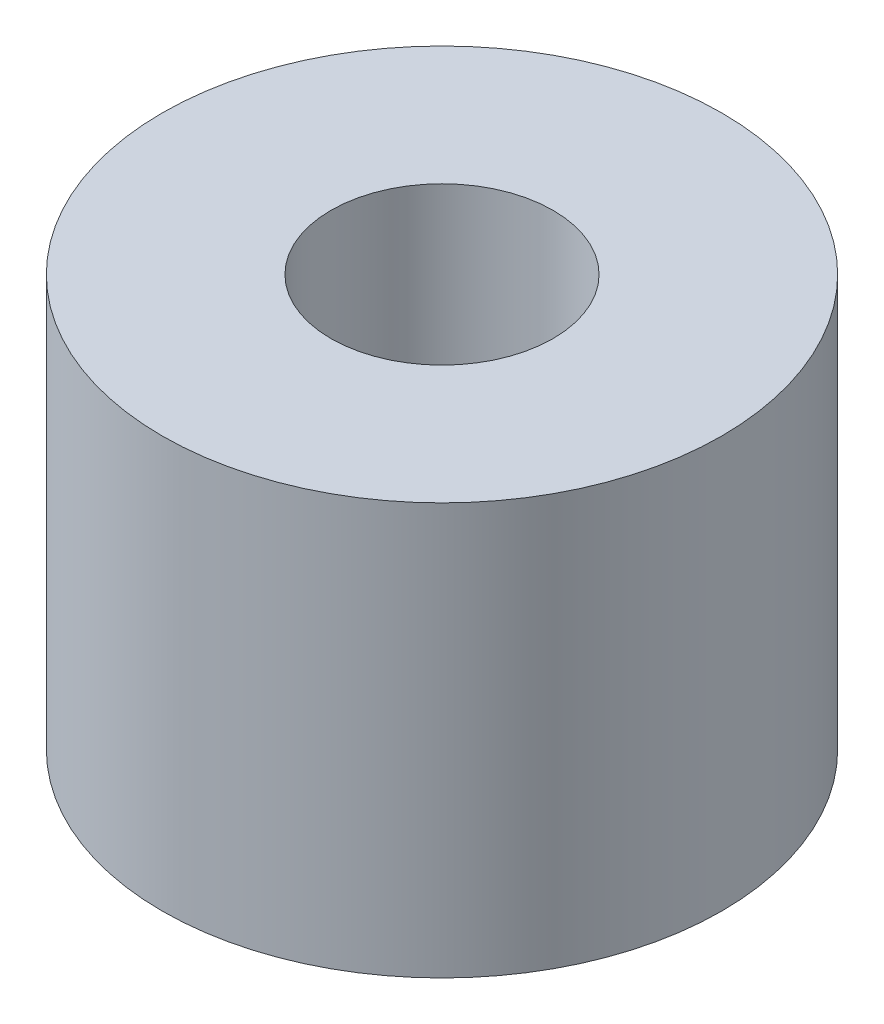
ISO-10303-21;
HEADER;
FILE_DESCRIPTION(('STEP AP214'),'2;1');
FILE_NAME('part.step','',(''),(''),'','','');
FILE_SCHEMA(('AUTOMOTIVE_DESIGN { 1 0 10303 214 1 1 1 1 }'));
ENDSEC;
DATA;
#1=APPLICATION_CONTEXT('core data for automotive mechanical design processes');
#2=APPLICATION_PROTOCOL_DEFINITION('international standard','automotive_design',2000,#1);
#3=PRODUCT_CONTEXT('',#1,'mechanical');
#4=PRODUCT('Part','Part','',(#3));
#5=PRODUCT_RELATED_PRODUCT_CATEGORY('part','',(#4));
#6=PRODUCT_DEFINITION_FORMATION('','',#4);
#7=PRODUCT_DEFINITION_CONTEXT('part definition',#1,'design');
#8=PRODUCT_DEFINITION('design','',#6,#7);
#9=PRODUCT_DEFINITION_SHAPE('','',#8);
#10=(LENGTH_UNIT() NAMED_UNIT(*) SI_UNIT(.MILLI.,.METRE.));
#11=(NAMED_UNIT(*) PLANE_ANGLE_UNIT() SI_UNIT($,.RADIAN.));
#12=(NAMED_UNIT(*) SI_UNIT($,.STERADIAN.) SOLID_ANGLE_UNIT());
#13=UNCERTAINTY_MEASURE_WITH_UNIT(LENGTH_MEASURE(1.E-05),#10,'distance_accuracy_value','');
#14=(GEOMETRIC_REPRESENTATION_CONTEXT(3) GLOBAL_UNCERTAINTY_ASSIGNED_CONTEXT((#13)) GLOBAL_UNIT_ASSIGNED_CONTEXT((#10,
#11,#12)) REPRESENTATION_CONTEXT('',''));
#15=CARTESIAN_POINT('',(0.,0.,0.));
#16=DIRECTION('',(0.,0.,1.));
#17=DIRECTION('',(1.,0.,0.));
#18=AXIS2_PLACEMENT_3D('',#15,#16,#17);
#19=CARTESIAN_POINT('',(0.,6.35,0.));
#20=DIRECTION('',(0.,1.,0.));
#21=DIRECTION('',(0.,0.,1.));
#22=AXIS2_PLACEMENT_3D('',#19,#20,#21);
#23=PLANE('',#22);
#24=CARTESIAN_POINT('',(0.,6.35,0.));
#25=DIRECTION('',(0.,1.,0.));
#26=DIRECTION('',(0.,0.,1.));
#27=AXIS2_PLACEMENT_3D('',#24,#25,#26);
#28=CIRCLE('',#27,4.318);
#29=CARTESIAN_POINT('',(0.,6.35,4.318));
#30=VERTEX_POINT('',#29);
#31=EDGE_CURVE('E10',#30,#30,#28,.T.);
#32=ORIENTED_EDGE('',*,*,#31,.T.);
#33=EDGE_LOOP('',(#32));
#34=FACE_BOUND('',#33,.T.);
#35=CARTESIAN_POINT('',(0.,6.35,0.));
#36=DIRECTION('',(0.,1.,0.));
#37=DIRECTION('',(0.,0.,1.));
#38=AXIS2_PLACEMENT_3D('',#35,#36,#37);
#39=CIRCLE('',#38,1.7145);
#40=CARTESIAN_POINT('',(0.,6.35,1.7145));
#41=VERTEX_POINT('',#40);
#42=EDGE_CURVE('E43',#41,#41,#39,.T.);
#43=ORIENTED_EDGE('',*,*,#42,.F.);
#44=EDGE_LOOP('',(#43));
#45=FACE_BOUND('',#44,.T.);
#46=ADVANCED_FACE('F32',(#34,#45),#23,.T.);
#47=CARTESIAN_POINT('',(0.,0.,0.));
#48=DIRECTION('',(0.,1.,0.));
#49=DIRECTION('',(0.,0.,1.));
#50=AXIS2_PLACEMENT_3D('',#47,#48,#49);
#51=PLANE('',#50);
#52=CARTESIAN_POINT('',(0.,0.,0.));
#53=DIRECTION('',(0.,1.,0.));
#54=DIRECTION('',(0.,0.,1.));
#55=AXIS2_PLACEMENT_3D('',#52,#53,#54);
#56=CIRCLE('',#55,4.318);
#57=CARTESIAN_POINT('',(0.,0.,4.318));
#58=VERTEX_POINT('',#57);
#59=EDGE_CURVE('E36',#58,#58,#56,.T.);
#60=ORIENTED_EDGE('',*,*,#59,.F.);
#61=EDGE_LOOP('',(#60));
#62=FACE_BOUND('',#61,.T.);
#63=CARTESIAN_POINT('',(0.,0.,0.));
#64=DIRECTION('',(0.,1.,0.));
#65=DIRECTION('',(0.,0.,1.));
#66=AXIS2_PLACEMENT_3D('',#63,#64,#65);
#67=CIRCLE('',#66,1.7145);
#68=CARTESIAN_POINT('',(0.,0.,1.7145));
#69=VERTEX_POINT('',#68);
#70=EDGE_CURVE('E45',#69,#69,#67,.T.);
#71=ORIENTED_EDGE('',*,*,#70,.T.);
#72=EDGE_LOOP('',(#71));
#73=FACE_BOUND('',#72,.T.);
#74=ADVANCED_FACE('F55',(#62,#73),#51,.F.);
#75=CARTESIAN_POINT('',(0.,6.35,0.));
#76=DIRECTION('',(0.,-1.,0.));
#77=DIRECTION('',(0.,0.,-1.));
#78=AXIS2_PLACEMENT_3D('',#75,#76,#77);
#79=CYLINDRICAL_SURFACE('',#78,4.318);
#80=ORIENTED_EDGE('',*,*,#31,.F.);
#81=EDGE_LOOP('',(#80));
#82=FACE_BOUND('',#81,.T.);
#83=ORIENTED_EDGE('',*,*,#59,.T.);
#84=EDGE_LOOP('',(#83));
#85=FACE_BOUND('',#84,.T.);
#86=ADVANCED_FACE('F34',(#82,#85),#79,.T.);
#87=CARTESIAN_POINT('',(0.,6.35,0.));
#88=DIRECTION('',(0.,-1.,0.));
#89=DIRECTION('',(0.,0.,-1.));
#90=AXIS2_PLACEMENT_3D('',#87,#88,#89);
#91=CYLINDRICAL_SURFACE('',#90,1.7145);
#92=ORIENTED_EDGE('',*,*,#42,.T.);
#93=EDGE_LOOP('',(#92));
#94=FACE_BOUND('',#93,.T.);
#95=ORIENTED_EDGE('',*,*,#70,.F.);
#96=EDGE_LOOP('',(#95));
#97=FACE_BOUND('',#96,.T.);
#98=ADVANCED_FACE('F51',(#94,#97),#91,.F.);
#99=CLOSED_SHELL('',(#46,#74,#86,#98));
#100=MANIFOLD_SOLID_BREP('B2',#99);
#101=ADVANCED_BREP_SHAPE_REPRESENTATION('',(#18,#100),#14);
#102=SHAPE_DEFINITION_REPRESENTATION(#9,#101);
ENDSEC;
END-ISO-10303-21;
